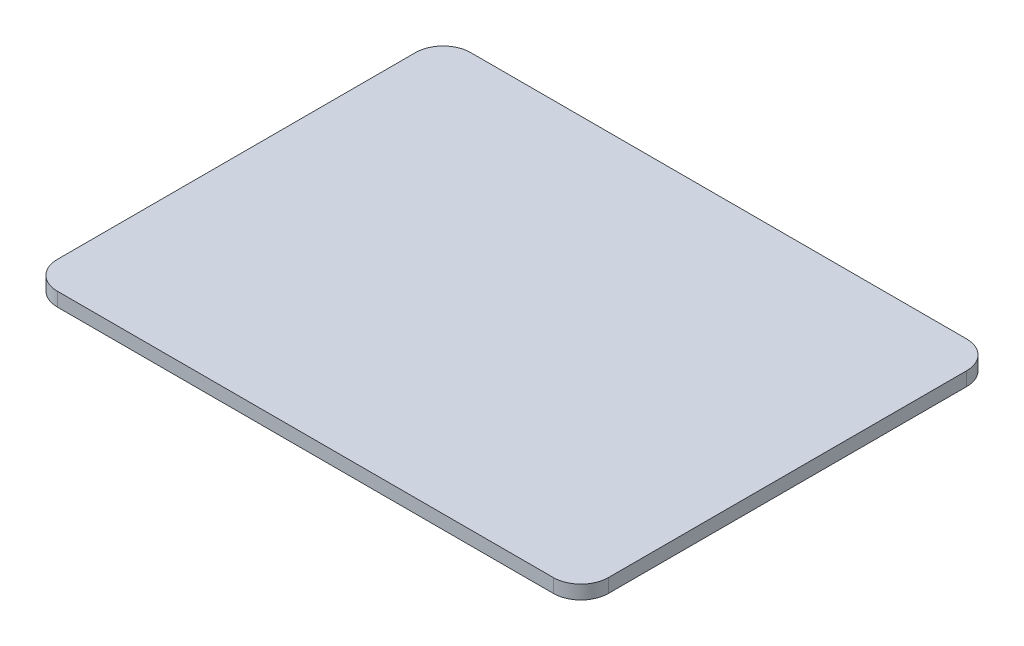
ISO-10303-21;
HEADER;
FILE_DESCRIPTION(('STEP AP214'),'2;1');
FILE_NAME('part.step','',(''),(''),'','','');
FILE_SCHEMA(('AUTOMOTIVE_DESIGN { 1 0 10303 214 1 1 1 1 }'));
ENDSEC;
DATA;
#1=APPLICATION_CONTEXT('core data for automotive mechanical design processes');
#2=APPLICATION_PROTOCOL_DEFINITION('international standard','automotive_design',2000,#1);
#3=PRODUCT_CONTEXT('',#1,'mechanical');
#4=PRODUCT('Part','Part','',(#3));
#5=PRODUCT_RELATED_PRODUCT_CATEGORY('part','',(#4));
#6=PRODUCT_DEFINITION_FORMATION('','',#4);
#7=PRODUCT_DEFINITION_CONTEXT('part definition',#1,'design');
#8=PRODUCT_DEFINITION('design','',#6,#7);
#9=PRODUCT_DEFINITION_SHAPE('','',#8);
#10=(LENGTH_UNIT() NAMED_UNIT(*) SI_UNIT(.MILLI.,.METRE.));
#11=(NAMED_UNIT(*) PLANE_ANGLE_UNIT() SI_UNIT($,.RADIAN.));
#12=(NAMED_UNIT(*) SI_UNIT($,.STERADIAN.) SOLID_ANGLE_UNIT());
#13=UNCERTAINTY_MEASURE_WITH_UNIT(LENGTH_MEASURE(1.E-05),#10,'distance_accuracy_value','');
#14=(GEOMETRIC_REPRESENTATION_CONTEXT(3) GLOBAL_UNCERTAINTY_ASSIGNED_CONTEXT((#13)) GLOBAL_UNIT_ASSIGNED_CONTEXT((#10,
#11,#12)) REPRESENTATION_CONTEXT('',''));
#15=CARTESIAN_POINT('',(0.,0.,0.));
#16=DIRECTION('',(0.,0.,1.));
#17=DIRECTION('',(1.,0.,0.));
#18=AXIS2_PLACEMENT_3D('',#15,#16,#17);
#19=CARTESIAN_POINT('',(4000.,200.,3000.));
#20=DIRECTION('',(-1.,0.,0.));
#21=DIRECTION('',(0.,0.,1.));
#22=AXIS2_PLACEMENT_3D('',#19,#20,#21);
#23=PLANE('',#22);
#24=DIRECTION('',(0.,0.,-1.));
#25=VECTOR('',#24,1.);
#26=CARTESIAN_POINT('',(4000.,0.,3000.));
#27=LINE('',#26,#25);
#28=CARTESIAN_POINT('',(4000.,0.,2600.));
#29=VERTEX_POINT('',#28);
#30=CARTESIAN_POINT('',(4000.,0.,-2600.));
#31=VERTEX_POINT('',#30);
#32=EDGE_CURVE('E129',#29,#31,#27,.T.);
#33=ORIENTED_EDGE('',*,*,#32,.T.);
#34=DIRECTION('',(0.,-1.,0.));
#35=VECTOR('',#34,1.);
#36=CARTESIAN_POINT('',(4000.,200.,-2600.));
#37=LINE('',#36,#35);
#38=CARTESIAN_POINT('',(4000.,200.,-2600.));
#39=VERTEX_POINT('',#38);
#40=EDGE_CURVE('E11',#31,#39,#37,.F.);
#41=ORIENTED_EDGE('',*,*,#40,.T.);
#42=DIRECTION('',(0.,0.,-1.));
#43=VECTOR('',#42,1.);
#44=CARTESIAN_POINT('',(4000.,200.,3000.));
#45=LINE('',#44,#43);
#46=CARTESIAN_POINT('',(4000.,200.,2600.));
#47=VERTEX_POINT('',#46);
#48=EDGE_CURVE('E127',#47,#39,#45,.T.);
#49=ORIENTED_EDGE('',*,*,#48,.F.);
#50=DIRECTION('',(0.,-1.,0.));
#51=VECTOR('',#50,1.);
#52=CARTESIAN_POINT('',(4000.,200.,2600.));
#53=LINE('',#52,#51);
#54=EDGE_CURVE('E41',#47,#29,#53,.T.);
#55=ORIENTED_EDGE('',*,*,#54,.T.);
#56=EDGE_LOOP('',(#33,#41,#49,#55));
#57=FACE_BOUND('',#56,.T.);
#58=ADVANCED_FACE('F33',(#57),#23,.F.);
#59=CARTESIAN_POINT('',(-4000.,200.,-3000.));
#60=DIRECTION('',(0.,0.,1.));
#61=DIRECTION('',(1.,0.,0.));
#62=AXIS2_PLACEMENT_3D('',#59,#60,#61);
#63=PLANE('',#62);
#64=DIRECTION('',(-1.,0.,0.));
#65=VECTOR('',#64,1.);
#66=CARTESIAN_POINT('',(-4000.,0.,-3000.));
#67=LINE('',#66,#65);
#68=CARTESIAN_POINT('',(3600.,0.,-3000.));
#69=VERTEX_POINT('',#68);
#70=CARTESIAN_POINT('',(-3600.,0.,-3000.));
#71=VERTEX_POINT('',#70);
#72=EDGE_CURVE('E125',#69,#71,#67,.T.);
#73=ORIENTED_EDGE('',*,*,#72,.T.);
#74=DIRECTION('',(0.,-1.,0.));
#75=VECTOR('',#74,1.);
#76=CARTESIAN_POINT('',(-3600.,200.,-3000.));
#77=LINE('',#76,#75);
#78=CARTESIAN_POINT('',(-3600.,200.,-3000.));
#79=VERTEX_POINT('',#78);
#80=EDGE_CURVE('E104',#71,#79,#77,.F.);
#81=ORIENTED_EDGE('',*,*,#80,.T.);
#82=DIRECTION('',(-1.,0.,0.));
#83=VECTOR('',#82,1.);
#84=CARTESIAN_POINT('',(-4000.,200.,-3000.));
#85=LINE('',#84,#83);
#86=CARTESIAN_POINT('',(3600.,200.,-3000.));
#87=VERTEX_POINT('',#86);
#88=EDGE_CURVE('E165',#87,#79,#85,.T.);
#89=ORIENTED_EDGE('',*,*,#88,.F.);
#90=DIRECTION('',(0.,-1.,0.));
#91=VECTOR('',#90,1.);
#92=CARTESIAN_POINT('',(3600.,200.,-3000.));
#93=LINE('',#92,#91);
#94=EDGE_CURVE('E109',#87,#69,#93,.T.);
#95=ORIENTED_EDGE('',*,*,#94,.T.);
#96=EDGE_LOOP('',(#73,#81,#89,#95));
#97=FACE_BOUND('',#96,.T.);
#98=ADVANCED_FACE('F175',(#97),#63,.F.);
#99=CARTESIAN_POINT('',(-4000.,200.,3000.));
#100=DIRECTION('',(1.,0.,0.));
#101=DIRECTION('',(0.,0.,-1.));
#102=AXIS2_PLACEMENT_3D('',#99,#100,#101);
#103=PLANE('',#102);
#104=DIRECTION('',(0.,0.,1.));
#105=VECTOR('',#104,1.);
#106=CARTESIAN_POINT('',(-4000.,200.,3000.));
#107=LINE('',#106,#105);
#108=CARTESIAN_POINT('',(-4000.,200.,-2600.));
#109=VERTEX_POINT('',#108);
#110=CARTESIAN_POINT('',(-4000.,200.,2600.));
#111=VERTEX_POINT('',#110);
#112=EDGE_CURVE('E118',#109,#111,#107,.T.);
#113=ORIENTED_EDGE('',*,*,#112,.F.);
#114=DIRECTION('',(0.,-1.,0.));
#115=VECTOR('',#114,1.);
#116=CARTESIAN_POINT('',(-4000.,200.,-2600.));
#117=LINE('',#116,#115);
#118=CARTESIAN_POINT('',(-4000.,0.,-2600.));
#119=VERTEX_POINT('',#118);
#120=EDGE_CURVE('E103',#109,#119,#117,.T.);
#121=ORIENTED_EDGE('',*,*,#120,.T.);
#122=DIRECTION('',(0.,0.,1.));
#123=VECTOR('',#122,1.);
#124=CARTESIAN_POINT('',(-4000.,0.,3000.));
#125=LINE('',#124,#123);
#126=CARTESIAN_POINT('',(-4000.,0.,2600.));
#127=VERTEX_POINT('',#126);
#128=EDGE_CURVE('E116',#119,#127,#125,.T.);
#129=ORIENTED_EDGE('',*,*,#128,.T.);
#130=DIRECTION('',(0.,-1.,0.));
#131=VECTOR('',#130,1.);
#132=CARTESIAN_POINT('',(-4000.,200.,2600.));
#133=LINE('',#132,#131);
#134=EDGE_CURVE('E120',#127,#111,#133,.F.);
#135=ORIENTED_EDGE('',*,*,#134,.T.);
#136=EDGE_LOOP('',(#113,#121,#129,#135));
#137=FACE_BOUND('',#136,.T.);
#138=ADVANCED_FACE('F115',(#137),#103,.F.);
#139=CARTESIAN_POINT('',(-4000.,200.,3000.));
#140=DIRECTION('',(0.,0.,-1.));
#141=DIRECTION('',(-1.,0.,0.));
#142=AXIS2_PLACEMENT_3D('',#139,#140,#141);
#143=PLANE('',#142);
#144=DIRECTION('',(1.,0.,0.));
#145=VECTOR('',#144,1.);
#146=CARTESIAN_POINT('',(-4000.,200.,3000.));
#147=LINE('',#146,#145);
#148=CARTESIAN_POINT('',(-3600.,200.,3000.));
#149=VERTEX_POINT('',#148);
#150=CARTESIAN_POINT('',(3600.,200.,3000.));
#151=VERTEX_POINT('',#150);
#152=EDGE_CURVE('E133',#149,#151,#147,.T.);
#153=ORIENTED_EDGE('',*,*,#152,.F.);
#154=DIRECTION('',(0.,-1.,0.));
#155=VECTOR('',#154,1.);
#156=CARTESIAN_POINT('',(-3600.,200.,3000.));
#157=LINE('',#156,#155);
#158=CARTESIAN_POINT('',(-3600.,0.,3000.));
#159=VERTEX_POINT('',#158);
#160=EDGE_CURVE('E150',#149,#159,#157,.T.);
#161=ORIENTED_EDGE('',*,*,#160,.T.);
#162=DIRECTION('',(1.,0.,0.));
#163=VECTOR('',#162,1.);
#164=CARTESIAN_POINT('',(-4000.,0.,3000.));
#165=LINE('',#164,#163);
#166=CARTESIAN_POINT('',(3600.,0.,3000.));
#167=VERTEX_POINT('',#166);
#168=EDGE_CURVE('E124',#159,#167,#165,.T.);
#169=ORIENTED_EDGE('',*,*,#168,.T.);
#170=DIRECTION('',(0.,-1.,0.));
#171=VECTOR('',#170,1.);
#172=CARTESIAN_POINT('',(3600.,200.,3000.));
#173=LINE('',#172,#171);
#174=EDGE_CURVE('E48',#167,#151,#173,.F.);
#175=ORIENTED_EDGE('',*,*,#174,.T.);
#176=EDGE_LOOP('',(#153,#161,#169,#175));
#177=FACE_BOUND('',#176,.T.);
#178=ADVANCED_FACE('F179',(#177),#143,.F.);
#179=CARTESIAN_POINT('',(0.,200.,0.));
#180=DIRECTION('',(0.,-1.,0.));
#181=DIRECTION('',(0.,0.,-1.));
#182=AXIS2_PLACEMENT_3D('',#179,#180,#181);
#183=PLANE('',#182);
#184=ORIENTED_EDGE('',*,*,#88,.T.);
#185=CARTESIAN_POINT('',(-3600.,200.,-2600.));
#186=DIRECTION('',(0.,-1.,0.));
#187=DIRECTION('',(0.,0.,-1.));
#188=AXIS2_PLACEMENT_3D('',#185,#186,#187);
#189=CIRCLE('',#188,400.);
#190=EDGE_CURVE('E147',#79,#109,#189,.F.);
#191=ORIENTED_EDGE('',*,*,#190,.T.);
#192=ORIENTED_EDGE('',*,*,#112,.T.);
#193=CARTESIAN_POINT('',(-3600.,200.,2600.));
#194=DIRECTION('',(0.,-1.,0.));
#195=DIRECTION('',(0.,0.,-1.));
#196=AXIS2_PLACEMENT_3D('',#193,#194,#195);
#197=CIRCLE('',#196,400.);
#198=EDGE_CURVE('E55',#111,#149,#197,.F.);
#199=ORIENTED_EDGE('',*,*,#198,.T.);
#200=ORIENTED_EDGE('',*,*,#152,.T.);
#201=CARTESIAN_POINT('',(3600.,200.,2600.));
#202=DIRECTION('',(0.,-1.,0.));
#203=DIRECTION('',(0.,0.,-1.));
#204=AXIS2_PLACEMENT_3D('',#201,#202,#203);
#205=CIRCLE('',#204,400.);
#206=EDGE_CURVE('E142',#151,#47,#205,.F.);
#207=ORIENTED_EDGE('',*,*,#206,.T.);
#208=ORIENTED_EDGE('',*,*,#48,.T.);
#209=CARTESIAN_POINT('',(3600.,200.,-2600.));
#210=DIRECTION('',(0.,-1.,0.));
#211=DIRECTION('',(0.,0.,-1.));
#212=AXIS2_PLACEMENT_3D('',#209,#210,#211);
#213=CIRCLE('',#212,400.);
#214=EDGE_CURVE('E144',#39,#87,#213,.F.);
#215=ORIENTED_EDGE('',*,*,#214,.T.);
#216=EDGE_LOOP('',(#184,#191,#192,#199,#200,#207,#208,#215));
#217=FACE_BOUND('',#216,.T.);
#218=ADVANCED_FACE('F169',(#217),#183,.F.);
#219=CARTESIAN_POINT('',(0.,0.,0.));
#220=DIRECTION('',(0.,-1.,0.));
#221=DIRECTION('',(0.,0.,-1.));
#222=AXIS2_PLACEMENT_3D('',#219,#220,#221);
#223=PLANE('',#222);
#224=ORIENTED_EDGE('',*,*,#128,.F.);
#225=CARTESIAN_POINT('',(-3600.,0.,-2600.));
#226=DIRECTION('',(0.,-1.,0.));
#227=DIRECTION('',(0.,0.,-1.));
#228=AXIS2_PLACEMENT_3D('',#225,#226,#227);
#229=CIRCLE('',#228,400.);
#230=EDGE_CURVE('E99',#119,#71,#229,.T.);
#231=ORIENTED_EDGE('',*,*,#230,.T.);
#232=ORIENTED_EDGE('',*,*,#72,.F.);
#233=CARTESIAN_POINT('',(3600.,0.,-2600.));
#234=DIRECTION('',(0.,-1.,0.));
#235=DIRECTION('',(0.,0.,-1.));
#236=AXIS2_PLACEMENT_3D('',#233,#234,#235);
#237=CIRCLE('',#236,400.);
#238=EDGE_CURVE('E136',#69,#31,#237,.T.);
#239=ORIENTED_EDGE('',*,*,#238,.T.);
#240=ORIENTED_EDGE('',*,*,#32,.F.);
#241=CARTESIAN_POINT('',(3600.,0.,2600.));
#242=DIRECTION('',(0.,-1.,0.));
#243=DIRECTION('',(0.,0.,-1.));
#244=AXIS2_PLACEMENT_3D('',#241,#242,#243);
#245=CIRCLE('',#244,400.);
#246=EDGE_CURVE('E119',#29,#167,#245,.T.);
#247=ORIENTED_EDGE('',*,*,#246,.T.);
#248=ORIENTED_EDGE('',*,*,#168,.F.);
#249=CARTESIAN_POINT('',(-3600.,0.,2600.));
#250=DIRECTION('',(0.,-1.,0.));
#251=DIRECTION('',(0.,0.,-1.));
#252=AXIS2_PLACEMENT_3D('',#249,#250,#251);
#253=CIRCLE('',#252,400.);
#254=EDGE_CURVE('E110',#159,#127,#253,.T.);
#255=ORIENTED_EDGE('',*,*,#254,.T.);
#256=EDGE_LOOP('',(#224,#231,#232,#239,#240,#247,#248,#255));
#257=FACE_BOUND('',#256,.T.);
#258=ADVANCED_FACE('F122',(#257),#223,.T.);
#259=CARTESIAN_POINT('',(-3600.,200.,-2600.));
#260=DIRECTION('',(0.,-1.,0.));
#261=DIRECTION('',(0.,0.,-1.));
#262=AXIS2_PLACEMENT_3D('',#259,#260,#261);
#263=CYLINDRICAL_SURFACE('',#262,400.);
#264=ORIENTED_EDGE('',*,*,#190,.F.);
#265=ORIENTED_EDGE('',*,*,#80,.F.);
#266=ORIENTED_EDGE('',*,*,#230,.F.);
#267=ORIENTED_EDGE('',*,*,#120,.F.);
#268=EDGE_LOOP('',(#264,#265,#266,#267));
#269=FACE_BOUND('',#268,.T.);
#270=ADVANCED_FACE('F102',(#269),#263,.T.);
#271=CARTESIAN_POINT('',(-3600.,200.,2600.));
#272=DIRECTION('',(0.,-1.,0.));
#273=DIRECTION('',(0.,0.,-1.));
#274=AXIS2_PLACEMENT_3D('',#271,#272,#273);
#275=CYLINDRICAL_SURFACE('',#274,400.);
#276=ORIENTED_EDGE('',*,*,#198,.F.);
#277=ORIENTED_EDGE('',*,*,#134,.F.);
#278=ORIENTED_EDGE('',*,*,#254,.F.);
#279=ORIENTED_EDGE('',*,*,#160,.F.);
#280=EDGE_LOOP('',(#276,#277,#278,#279));
#281=FACE_BOUND('',#280,.T.);
#282=ADVANCED_FACE('F178',(#281),#275,.T.);
#283=CARTESIAN_POINT('',(3600.,200.,-2600.));
#284=DIRECTION('',(0.,-1.,0.));
#285=DIRECTION('',(0.,0.,-1.));
#286=AXIS2_PLACEMENT_3D('',#283,#284,#285);
#287=CYLINDRICAL_SURFACE('',#286,400.);
#288=ORIENTED_EDGE('',*,*,#214,.F.);
#289=ORIENTED_EDGE('',*,*,#40,.F.);
#290=ORIENTED_EDGE('',*,*,#238,.F.);
#291=ORIENTED_EDGE('',*,*,#94,.F.);
#292=EDGE_LOOP('',(#288,#289,#290,#291));
#293=FACE_BOUND('',#292,.T.);
#294=ADVANCED_FACE('F173',(#293),#287,.T.);
#295=CARTESIAN_POINT('',(3600.,200.,2600.));
#296=DIRECTION('',(0.,-1.,0.));
#297=DIRECTION('',(0.,0.,-1.));
#298=AXIS2_PLACEMENT_3D('',#295,#296,#297);
#299=CYLINDRICAL_SURFACE('',#298,400.);
#300=ORIENTED_EDGE('',*,*,#206,.F.);
#301=ORIENTED_EDGE('',*,*,#174,.F.);
#302=ORIENTED_EDGE('',*,*,#246,.F.);
#303=ORIENTED_EDGE('',*,*,#54,.F.);
#304=EDGE_LOOP('',(#300,#301,#302,#303));
#305=FACE_BOUND('',#304,.T.);
#306=ADVANCED_FACE('F35',(#305),#299,.T.);
#307=CLOSED_SHELL('',(#58,#98,#138,#178,#218,#258,#270,#282,#294,#306));
#308=MANIFOLD_SOLID_BREP('B2',#307);
#309=ADVANCED_BREP_SHAPE_REPRESENTATION('',(#18,#308),#14);
#310=SHAPE_DEFINITION_REPRESENTATION(#9,#309);
ENDSEC;
END-ISO-10303-21;
